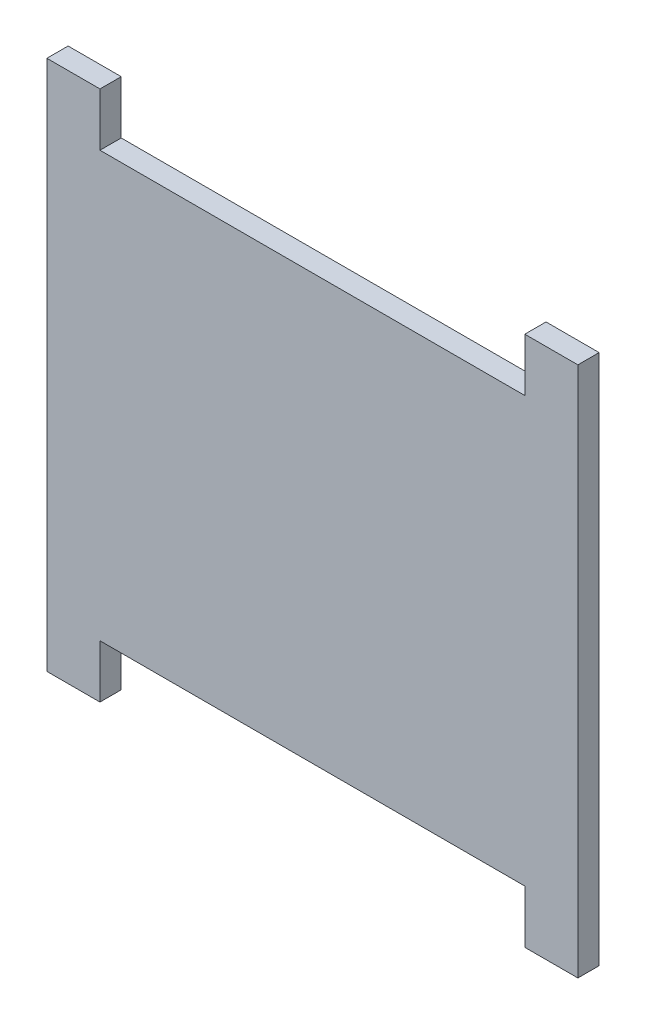
ISO-10303-21;
HEADER;
FILE_DESCRIPTION(('STEP AP214'),'2;1');
FILE_NAME('part.step','',(''),(''),'','','');
FILE_SCHEMA(('AUTOMOTIVE_DESIGN { 1 0 10303 214 1 1 1 1 }'));
ENDSEC;
DATA;
#1=APPLICATION_CONTEXT('core data for automotive mechanical design processes');
#2=APPLICATION_PROTOCOL_DEFINITION('international standard','automotive_design',2000,#1);
#3=PRODUCT_CONTEXT('',#1,'mechanical');
#4=PRODUCT('Part','Part','',(#3));
#5=PRODUCT_RELATED_PRODUCT_CATEGORY('part','',(#4));
#6=PRODUCT_DEFINITION_FORMATION('','',#4);
#7=PRODUCT_DEFINITION_CONTEXT('part definition',#1,'design');
#8=PRODUCT_DEFINITION('design','',#6,#7);
#9=PRODUCT_DEFINITION_SHAPE('','',#8);
#10=(LENGTH_UNIT() NAMED_UNIT(*) SI_UNIT(.MILLI.,.METRE.));
#11=(NAMED_UNIT(*) PLANE_ANGLE_UNIT() SI_UNIT($,.RADIAN.));
#12=(NAMED_UNIT(*) SI_UNIT($,.STERADIAN.) SOLID_ANGLE_UNIT());
#13=UNCERTAINTY_MEASURE_WITH_UNIT(LENGTH_MEASURE(1.E-05),#10,'distance_accuracy_value','');
#14=(GEOMETRIC_REPRESENTATION_CONTEXT(3) GLOBAL_UNCERTAINTY_ASSIGNED_CONTEXT((#13)) GLOBAL_UNIT_ASSIGNED_CONTEXT((#10,
#11,#12)) REPRESENTATION_CONTEXT('',''));
#15=CARTESIAN_POINT('',(0.,0.,0.));
#16=DIRECTION('',(0.,0.,1.));
#17=DIRECTION('',(1.,0.,0.));
#18=AXIS2_PLACEMENT_3D('',#15,#16,#17);
#19=CARTESIAN_POINT('',(0.,0.,2.));
#20=DIRECTION('',(-1.,0.,0.));
#21=DIRECTION('',(0.,-1.,0.));
#22=AXIS2_PLACEMENT_3D('',#19,#20,#21);
#23=PLANE('',#22);
#24=DIRECTION('',(0.,1.,0.));
#25=VECTOR('',#24,1.);
#26=CARTESIAN_POINT('',(0.,0.,0.));
#27=LINE('',#26,#25);
#28=CARTESIAN_POINT('',(0.,-5.,0.));
#29=VERTEX_POINT('',#28);
#30=CARTESIAN_POINT('',(0.,0.,0.));
#31=VERTEX_POINT('',#30);
#32=EDGE_CURVE('E154',#29,#31,#27,.T.);
#33=ORIENTED_EDGE('',*,*,#32,.T.);
#34=DIRECTION('',(0.,0.,-1.));
#35=VECTOR('',#34,1.);
#36=CARTESIAN_POINT('',(0.,0.,2.));
#37=LINE('',#36,#35);
#38=CARTESIAN_POINT('',(0.,0.,2.));
#39=VERTEX_POINT('',#38);
#40=EDGE_CURVE('E11',#39,#31,#37,.T.);
#41=ORIENTED_EDGE('',*,*,#40,.F.);
#42=DIRECTION('',(0.,1.,0.));
#43=VECTOR('',#42,1.);
#44=CARTESIAN_POINT('',(0.,0.,2.));
#45=LINE('',#44,#43);
#46=CARTESIAN_POINT('',(0.,-5.,2.));
#47=VERTEX_POINT('',#46);
#48=EDGE_CURVE('E176',#47,#39,#45,.T.);
#49=ORIENTED_EDGE('',*,*,#48,.F.);
#50=DIRECTION('',(0.,0.,-1.));
#51=VECTOR('',#50,1.);
#52=CARTESIAN_POINT('',(0.,-5.,2.));
#53=LINE('',#52,#51);
#54=EDGE_CURVE('E150',#47,#29,#53,.T.);
#55=ORIENTED_EDGE('',*,*,#54,.T.);
#56=EDGE_LOOP('',(#33,#41,#49,#55));
#57=FACE_BOUND('',#56,.T.);
#58=ADVANCED_FACE('F34',(#57),#23,.F.);
#59=CARTESIAN_POINT('',(0.,0.,2.));
#60=DIRECTION('',(0.,1.,0.));
#61=DIRECTION('',(-1.,0.,0.));
#62=AXIS2_PLACEMENT_3D('',#59,#60,#61);
#63=PLANE('',#62);
#64=DIRECTION('',(1.,0.,0.));
#65=VECTOR('',#64,1.);
#66=CARTESIAN_POINT('',(0.,0.,0.));
#67=LINE('',#66,#65);
#68=CARTESIAN_POINT('',(40.,0.,0.));
#69=VERTEX_POINT('',#68);
#70=EDGE_CURVE('E157',#31,#69,#67,.T.);
#71=ORIENTED_EDGE('',*,*,#70,.T.);
#72=DIRECTION('',(0.,0.,-1.));
#73=VECTOR('',#72,1.);
#74=CARTESIAN_POINT('',(40.,0.,2.));
#75=LINE('',#74,#73);
#76=CARTESIAN_POINT('',(40.,0.,2.));
#77=VERTEX_POINT('',#76);
#78=EDGE_CURVE('E42',#77,#69,#75,.T.);
#79=ORIENTED_EDGE('',*,*,#78,.F.);
#80=DIRECTION('',(1.,0.,0.));
#81=VECTOR('',#80,1.);
#82=CARTESIAN_POINT('',(0.,0.,2.));
#83=LINE('',#82,#81);
#84=EDGE_CURVE('E105',#39,#77,#83,.T.);
#85=ORIENTED_EDGE('',*,*,#84,.F.);
#86=ORIENTED_EDGE('',*,*,#40,.T.);
#87=EDGE_LOOP('',(#71,#79,#85,#86));
#88=FACE_BOUND('',#87,.T.);
#89=ADVANCED_FACE('F254',(#88),#63,.F.);
#90=CARTESIAN_POINT('',(40.,0.,2.));
#91=DIRECTION('',(1.,0.,0.));
#92=DIRECTION('',(0.,1.,0.));
#93=AXIS2_PLACEMENT_3D('',#90,#91,#92);
#94=PLANE('',#93);
#95=DIRECTION('',(0.,-1.,0.));
#96=VECTOR('',#95,1.);
#97=CARTESIAN_POINT('',(40.,0.,0.));
#98=LINE('',#97,#96);
#99=CARTESIAN_POINT('',(40.,-5.,0.));
#100=VERTEX_POINT('',#99);
#101=EDGE_CURVE('E159',#69,#100,#98,.T.);
#102=ORIENTED_EDGE('',*,*,#101,.T.);
#103=DIRECTION('',(0.,0.,-1.));
#104=VECTOR('',#103,1.);
#105=CARTESIAN_POINT('',(40.,-5.,2.));
#106=LINE('',#105,#104);
#107=CARTESIAN_POINT('',(40.,-5.,2.));
#108=VERTEX_POINT('',#107);
#109=EDGE_CURVE('E195',#108,#100,#106,.T.);
#110=ORIENTED_EDGE('',*,*,#109,.F.);
#111=DIRECTION('',(0.,-1.,0.));
#112=VECTOR('',#111,1.);
#113=CARTESIAN_POINT('',(40.,0.,2.));
#114=LINE('',#113,#112);
#115=EDGE_CURVE('E203',#77,#108,#114,.T.);
#116=ORIENTED_EDGE('',*,*,#115,.F.);
#117=ORIENTED_EDGE('',*,*,#78,.T.);
#118=EDGE_LOOP('',(#102,#110,#116,#117));
#119=FACE_BOUND('',#118,.T.);
#120=ADVANCED_FACE('F201',(#119),#94,.F.);
#121=CARTESIAN_POINT('',(40.,-5.,2.));
#122=DIRECTION('',(0.,1.,0.));
#123=DIRECTION('',(-1.,0.,0.));
#124=AXIS2_PLACEMENT_3D('',#121,#122,#123);
#125=PLANE('',#124);
#126=DIRECTION('',(1.,0.,0.));
#127=VECTOR('',#126,1.);
#128=CARTESIAN_POINT('',(40.,-5.,0.));
#129=LINE('',#128,#127);
#130=CARTESIAN_POINT('',(45.,-5.,0.));
#131=VERTEX_POINT('',#130);
#132=EDGE_CURVE('E161',#100,#131,#129,.T.);
#133=ORIENTED_EDGE('',*,*,#132,.T.);
#134=DIRECTION('',(0.,0.,-1.));
#135=VECTOR('',#134,1.);
#136=CARTESIAN_POINT('',(45.,-5.,2.));
#137=LINE('',#136,#135);
#138=CARTESIAN_POINT('',(45.,-5.,2.));
#139=VERTEX_POINT('',#138);
#140=EDGE_CURVE('E192',#139,#131,#137,.T.);
#141=ORIENTED_EDGE('',*,*,#140,.F.);
#142=DIRECTION('',(1.,0.,0.));
#143=VECTOR('',#142,1.);
#144=CARTESIAN_POINT('',(40.,-5.,2.));
#145=LINE('',#144,#143);
#146=EDGE_CURVE('E221',#108,#139,#145,.T.);
#147=ORIENTED_EDGE('',*,*,#146,.F.);
#148=ORIENTED_EDGE('',*,*,#109,.T.);
#149=EDGE_LOOP('',(#133,#141,#147,#148));
#150=FACE_BOUND('',#149,.T.);
#151=ADVANCED_FACE('F212',(#150),#125,.F.);
#152=CARTESIAN_POINT('',(45.,45.,2.));
#153=DIRECTION('',(-1.,0.,0.));
#154=DIRECTION('',(0.,0.,1.));
#155=AXIS2_PLACEMENT_3D('',#152,#153,#154);
#156=PLANE('',#155);
#157=DIRECTION('',(0.,1.,0.));
#158=VECTOR('',#157,1.);
#159=CARTESIAN_POINT('',(45.,45.,0.));
#160=LINE('',#159,#158);
#161=CARTESIAN_POINT('',(45.,45.,0.));
#162=VERTEX_POINT('',#161);
#163=EDGE_CURVE('E163',#131,#162,#160,.T.);
#164=ORIENTED_EDGE('',*,*,#163,.T.);
#165=DIRECTION('',(0.,0.,-1.));
#166=VECTOR('',#165,1.);
#167=CARTESIAN_POINT('',(45.,45.,2.));
#168=LINE('',#167,#166);
#169=CARTESIAN_POINT('',(45.,45.,2.));
#170=VERTEX_POINT('',#169);
#171=EDGE_CURVE('E189',#170,#162,#168,.T.);
#172=ORIENTED_EDGE('',*,*,#171,.F.);
#173=DIRECTION('',(0.,1.,0.));
#174=VECTOR('',#173,1.);
#175=CARTESIAN_POINT('',(45.,45.,2.));
#176=LINE('',#175,#174);
#177=EDGE_CURVE('E218',#139,#170,#176,.T.);
#178=ORIENTED_EDGE('',*,*,#177,.F.);
#179=ORIENTED_EDGE('',*,*,#140,.T.);
#180=EDGE_LOOP('',(#164,#172,#178,#179));
#181=FACE_BOUND('',#180,.T.);
#182=ADVANCED_FACE('F216',(#181),#156,.F.);
#183=CARTESIAN_POINT('',(40.,45.,2.));
#184=DIRECTION('',(0.,-1.,0.));
#185=DIRECTION('',(0.,0.,-1.));
#186=AXIS2_PLACEMENT_3D('',#183,#184,#185);
#187=PLANE('',#186);
#188=DIRECTION('',(-1.,0.,0.));
#189=VECTOR('',#188,1.);
#190=CARTESIAN_POINT('',(40.,45.,0.));
#191=LINE('',#190,#189);
#192=CARTESIAN_POINT('',(40.,45.,0.));
#193=VERTEX_POINT('',#192);
#194=EDGE_CURVE('E165',#162,#193,#191,.T.);
#195=ORIENTED_EDGE('',*,*,#194,.T.);
#196=DIRECTION('',(0.,0.,-1.));
#197=VECTOR('',#196,1.);
#198=CARTESIAN_POINT('',(40.,45.,2.));
#199=LINE('',#198,#197);
#200=CARTESIAN_POINT('',(40.,45.,2.));
#201=VERTEX_POINT('',#200);
#202=EDGE_CURVE('E186',#201,#193,#199,.T.);
#203=ORIENTED_EDGE('',*,*,#202,.F.);
#204=DIRECTION('',(-1.,0.,0.));
#205=VECTOR('',#204,1.);
#206=CARTESIAN_POINT('',(40.,45.,2.));
#207=LINE('',#206,#205);
#208=EDGE_CURVE('E220',#170,#201,#207,.T.);
#209=ORIENTED_EDGE('',*,*,#208,.F.);
#210=ORIENTED_EDGE('',*,*,#171,.T.);
#211=EDGE_LOOP('',(#195,#203,#209,#210));
#212=FACE_BOUND('',#211,.T.);
#213=ADVANCED_FACE('F267',(#212),#187,.F.);
#214=CARTESIAN_POINT('',(40.,45.,2.));
#215=DIRECTION('',(1.,0.,0.));
#216=DIRECTION('',(0.,0.,-1.));
#217=AXIS2_PLACEMENT_3D('',#214,#215,#216);
#218=PLANE('',#217);
#219=DIRECTION('',(0.,-1.,0.));
#220=VECTOR('',#219,1.);
#221=CARTESIAN_POINT('',(40.,45.,0.));
#222=LINE('',#221,#220);
#223=CARTESIAN_POINT('',(40.,40.,0.));
#224=VERTEX_POINT('',#223);
#225=EDGE_CURVE('E167',#193,#224,#222,.T.);
#226=ORIENTED_EDGE('',*,*,#225,.T.);
#227=DIRECTION('',(0.,0.,-1.));
#228=VECTOR('',#227,1.);
#229=CARTESIAN_POINT('',(40.,40.,2.));
#230=LINE('',#229,#228);
#231=CARTESIAN_POINT('',(40.,40.,2.));
#232=VERTEX_POINT('',#231);
#233=EDGE_CURVE('E183',#232,#224,#230,.T.);
#234=ORIENTED_EDGE('',*,*,#233,.F.);
#235=DIRECTION('',(0.,-1.,0.));
#236=VECTOR('',#235,1.);
#237=CARTESIAN_POINT('',(40.,45.,2.));
#238=LINE('',#237,#236);
#239=EDGE_CURVE('E223',#201,#232,#238,.T.);
#240=ORIENTED_EDGE('',*,*,#239,.F.);
#241=ORIENTED_EDGE('',*,*,#202,.T.);
#242=EDGE_LOOP('',(#226,#234,#240,#241));
#243=FACE_BOUND('',#242,.T.);
#244=ADVANCED_FACE('F270',(#243),#218,.F.);
#245=CARTESIAN_POINT('',(0.,40.,2.));
#246=DIRECTION('',(0.,-1.,0.));
#247=DIRECTION('',(1.,0.,0.));
#248=AXIS2_PLACEMENT_3D('',#245,#246,#247);
#249=PLANE('',#248);
#250=DIRECTION('',(-1.,0.,0.));
#251=VECTOR('',#250,1.);
#252=CARTESIAN_POINT('',(0.,40.,0.));
#253=LINE('',#252,#251);
#254=CARTESIAN_POINT('',(0.,40.,0.));
#255=VERTEX_POINT('',#254);
#256=EDGE_CURVE('E169',#224,#255,#253,.T.);
#257=ORIENTED_EDGE('',*,*,#256,.T.);
#258=DIRECTION('',(0.,0.,-1.));
#259=VECTOR('',#258,1.);
#260=CARTESIAN_POINT('',(0.,40.,2.));
#261=LINE('',#260,#259);
#262=CARTESIAN_POINT('',(0.,40.,2.));
#263=VERTEX_POINT('',#262);
#264=EDGE_CURVE('E180',#263,#255,#261,.T.);
#265=ORIENTED_EDGE('',*,*,#264,.F.);
#266=DIRECTION('',(-1.,0.,0.));
#267=VECTOR('',#266,1.);
#268=CARTESIAN_POINT('',(0.,40.,2.));
#269=LINE('',#268,#267);
#270=EDGE_CURVE('E229',#232,#263,#269,.T.);
#271=ORIENTED_EDGE('',*,*,#270,.F.);
#272=ORIENTED_EDGE('',*,*,#233,.T.);
#273=EDGE_LOOP('',(#257,#265,#271,#272));
#274=FACE_BOUND('',#273,.T.);
#275=ADVANCED_FACE('F235',(#274),#249,.F.);
#276=CARTESIAN_POINT('',(0.,45.,2.));
#277=DIRECTION('',(-1.,0.,0.));
#278=DIRECTION('',(0.,0.,1.));
#279=AXIS2_PLACEMENT_3D('',#276,#277,#278);
#280=PLANE('',#279);
#281=DIRECTION('',(0.,1.,0.));
#282=VECTOR('',#281,1.);
#283=CARTESIAN_POINT('',(0.,45.,0.));
#284=LINE('',#283,#282);
#285=CARTESIAN_POINT('',(0.,45.,0.));
#286=VERTEX_POINT('',#285);
#287=EDGE_CURVE('E171',#255,#286,#284,.T.);
#288=ORIENTED_EDGE('',*,*,#287,.T.);
#289=DIRECTION('',(0.,0.,-1.));
#290=VECTOR('',#289,1.);
#291=CARTESIAN_POINT('',(0.,45.,2.));
#292=LINE('',#291,#290);
#293=CARTESIAN_POINT('',(0.,45.,2.));
#294=VERTEX_POINT('',#293);
#295=EDGE_CURVE('E145',#294,#286,#292,.T.);
#296=ORIENTED_EDGE('',*,*,#295,.F.);
#297=DIRECTION('',(0.,1.,0.));
#298=VECTOR('',#297,1.);
#299=CARTESIAN_POINT('',(0.,45.,2.));
#300=LINE('',#299,#298);
#301=EDGE_CURVE('E136',#263,#294,#300,.T.);
#302=ORIENTED_EDGE('',*,*,#301,.F.);
#303=ORIENTED_EDGE('',*,*,#264,.T.);
#304=EDGE_LOOP('',(#288,#296,#302,#303));
#305=FACE_BOUND('',#304,.T.);
#306=ADVANCED_FACE('F239',(#305),#280,.F.);
#307=CARTESIAN_POINT('',(0.,45.,2.));
#308=DIRECTION('',(0.,-1.,0.));
#309=DIRECTION('',(0.,0.,-1.));
#310=AXIS2_PLACEMENT_3D('',#307,#308,#309);
#311=PLANE('',#310);
#312=DIRECTION('',(-1.,0.,0.));
#313=VECTOR('',#312,1.);
#314=CARTESIAN_POINT('',(0.,45.,0.));
#315=LINE('',#314,#313);
#316=CARTESIAN_POINT('',(-5.,45.,0.));
#317=VERTEX_POINT('',#316);
#318=EDGE_CURVE('E144',#286,#317,#315,.T.);
#319=ORIENTED_EDGE('',*,*,#318,.T.);
#320=DIRECTION('',(0.,0.,-1.));
#321=VECTOR('',#320,1.);
#322=CARTESIAN_POINT('',(-5.,45.,2.));
#323=LINE('',#322,#321);
#324=CARTESIAN_POINT('',(-5.,45.,2.));
#325=VERTEX_POINT('',#324);
#326=EDGE_CURVE('E141',#325,#317,#323,.T.);
#327=ORIENTED_EDGE('',*,*,#326,.F.);
#328=DIRECTION('',(-1.,0.,0.));
#329=VECTOR('',#328,1.);
#330=CARTESIAN_POINT('',(0.,45.,2.));
#331=LINE('',#330,#329);
#332=EDGE_CURVE('E130',#294,#325,#331,.T.);
#333=ORIENTED_EDGE('',*,*,#332,.F.);
#334=ORIENTED_EDGE('',*,*,#295,.T.);
#335=EDGE_LOOP('',(#319,#327,#333,#334));
#336=FACE_BOUND('',#335,.T.);
#337=ADVANCED_FACE('F142',(#336),#311,.F.);
#338=CARTESIAN_POINT('',(-5.,45.,2.));
#339=DIRECTION('',(1.,0.,0.));
#340=DIRECTION('',(0.,0.,-1.));
#341=AXIS2_PLACEMENT_3D('',#338,#339,#340);
#342=PLANE('',#341);
#343=DIRECTION('',(0.,-1.,0.));
#344=VECTOR('',#343,1.);
#345=CARTESIAN_POINT('',(-5.,45.,0.));
#346=LINE('',#345,#344);
#347=CARTESIAN_POINT('',(-5.,-5.,0.));
#348=VERTEX_POINT('',#347);
#349=EDGE_CURVE('E91',#317,#348,#346,.T.);
#350=ORIENTED_EDGE('',*,*,#349,.T.);
#351=DIRECTION('',(0.,0.,-1.));
#352=VECTOR('',#351,1.);
#353=CARTESIAN_POINT('',(-5.,-5.,2.));
#354=LINE('',#353,#352);
#355=CARTESIAN_POINT('',(-5.,-5.,2.));
#356=VERTEX_POINT('',#355);
#357=EDGE_CURVE('E146',#356,#348,#354,.T.);
#358=ORIENTED_EDGE('',*,*,#357,.F.);
#359=DIRECTION('',(0.,-1.,0.));
#360=VECTOR('',#359,1.);
#361=CARTESIAN_POINT('',(-5.,45.,2.));
#362=LINE('',#361,#360);
#363=EDGE_CURVE('E134',#325,#356,#362,.T.);
#364=ORIENTED_EDGE('',*,*,#363,.F.);
#365=ORIENTED_EDGE('',*,*,#326,.T.);
#366=EDGE_LOOP('',(#350,#358,#364,#365));
#367=FACE_BOUND('',#366,.T.);
#368=ADVANCED_FACE('F148',(#367),#342,.F.);
#369=CARTESIAN_POINT('',(0.,-5.,2.));
#370=DIRECTION('',(0.,1.,0.));
#371=DIRECTION('',(0.,0.,1.));
#372=AXIS2_PLACEMENT_3D('',#369,#370,#371);
#373=PLANE('',#372);
#374=DIRECTION('',(1.,0.,0.));
#375=VECTOR('',#374,1.);
#376=CARTESIAN_POINT('',(0.,-5.,0.));
#377=LINE('',#376,#375);
#378=EDGE_CURVE('E97',#348,#29,#377,.T.);
#379=ORIENTED_EDGE('',*,*,#378,.T.);
#380=ORIENTED_EDGE('',*,*,#54,.F.);
#381=DIRECTION('',(1.,0.,0.));
#382=VECTOR('',#381,1.);
#383=CARTESIAN_POINT('',(0.,-5.,2.));
#384=LINE('',#383,#382);
#385=EDGE_CURVE('E50',#356,#47,#384,.T.);
#386=ORIENTED_EDGE('',*,*,#385,.F.);
#387=ORIENTED_EDGE('',*,*,#357,.T.);
#388=EDGE_LOOP('',(#379,#380,#386,#387));
#389=FACE_BOUND('',#388,.T.);
#390=ADVANCED_FACE('F243',(#389),#373,.F.);
#391=CARTESIAN_POINT('',(0.,0.,2.));
#392=DIRECTION('',(0.,0.,-1.));
#393=DIRECTION('',(-1.,0.,0.));
#394=AXIS2_PLACEMENT_3D('',#391,#392,#393);
#395=PLANE('',#394);
#396=ORIENTED_EDGE('',*,*,#48,.T.);
#397=ORIENTED_EDGE('',*,*,#84,.T.);
#398=ORIENTED_EDGE('',*,*,#115,.T.);
#399=ORIENTED_EDGE('',*,*,#146,.T.);
#400=ORIENTED_EDGE('',*,*,#177,.T.);
#401=ORIENTED_EDGE('',*,*,#208,.T.);
#402=ORIENTED_EDGE('',*,*,#239,.T.);
#403=ORIENTED_EDGE('',*,*,#270,.T.);
#404=ORIENTED_EDGE('',*,*,#301,.T.);
#405=ORIENTED_EDGE('',*,*,#332,.T.);
#406=ORIENTED_EDGE('',*,*,#363,.T.);
#407=ORIENTED_EDGE('',*,*,#385,.T.);
#408=EDGE_LOOP('',(#396,#397,#398,#399,#400,#401,#402,#403,#404,#405,#406,#407));
#409=FACE_BOUND('',#408,.T.);
#410=ADVANCED_FACE('F132',(#409),#395,.F.);
#411=CARTESIAN_POINT('',(0.,0.,0.));
#412=DIRECTION('',(0.,0.,-1.));
#413=DIRECTION('',(-1.,0.,0.));
#414=AXIS2_PLACEMENT_3D('',#411,#412,#413);
#415=PLANE('',#414);
#416=ORIENTED_EDGE('',*,*,#32,.F.);
#417=ORIENTED_EDGE('',*,*,#378,.F.);
#418=ORIENTED_EDGE('',*,*,#349,.F.);
#419=ORIENTED_EDGE('',*,*,#318,.F.);
#420=ORIENTED_EDGE('',*,*,#287,.F.);
#421=ORIENTED_EDGE('',*,*,#256,.F.);
#422=ORIENTED_EDGE('',*,*,#225,.F.);
#423=ORIENTED_EDGE('',*,*,#194,.F.);
#424=ORIENTED_EDGE('',*,*,#163,.F.);
#425=ORIENTED_EDGE('',*,*,#132,.F.);
#426=ORIENTED_EDGE('',*,*,#101,.F.);
#427=ORIENTED_EDGE('',*,*,#70,.F.);
#428=EDGE_LOOP('',(#416,#417,#418,#419,#420,#421,#422,#423,#424,#425,#426,#427));
#429=FACE_BOUND('',#428,.T.);
#430=ADVANCED_FACE('F207',(#429),#415,.T.);
#431=CLOSED_SHELL('',(#58,#89,#120,#151,#182,#213,#244,#275,#306,#337,#368,#390,#410,#430));
#432=MANIFOLD_SOLID_BREP('B2',#431);
#433=ADVANCED_BREP_SHAPE_REPRESENTATION('',(#18,#432),#14);
#434=SHAPE_DEFINITION_REPRESENTATION(#9,#433);
ENDSEC;
END-ISO-10303-21;
